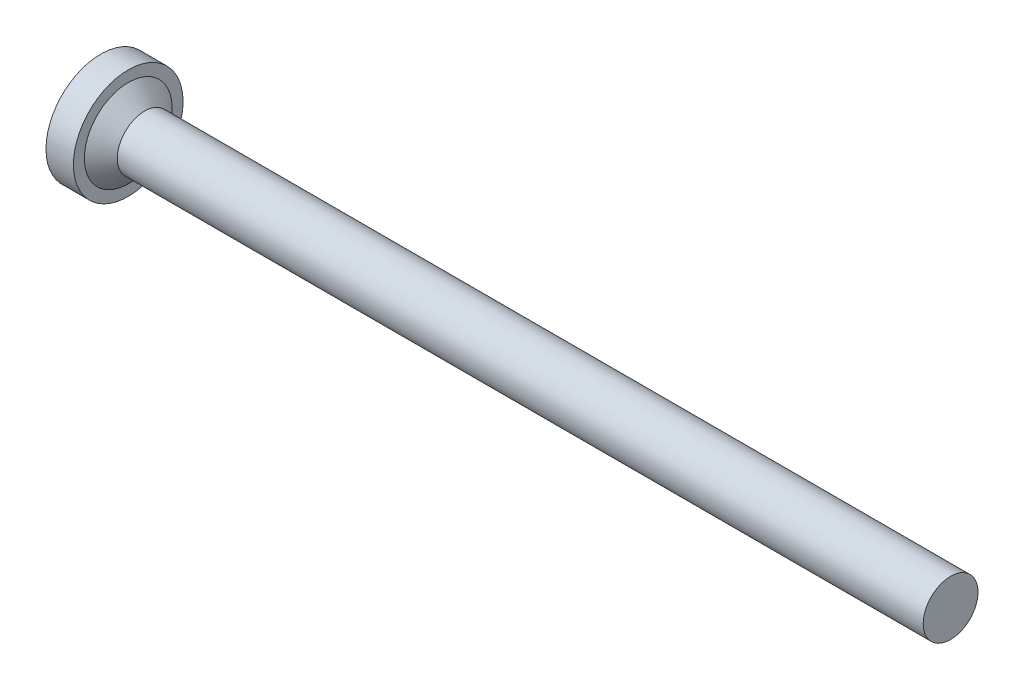
ISO-10303-21;
HEADER;
FILE_DESCRIPTION(('STEP AP214'),'2;1');
FILE_NAME('part.step','',(''),(''),'','','');
FILE_SCHEMA(('AUTOMOTIVE_DESIGN { 1 0 10303 214 1 1 1 1 }'));
ENDSEC;
DATA;
#1=APPLICATION_CONTEXT('core data for automotive mechanical design processes');
#2=APPLICATION_PROTOCOL_DEFINITION('international standard','automotive_design',2000,#1);
#3=PRODUCT_CONTEXT('',#1,'mechanical');
#4=PRODUCT('Part','Part','',(#3));
#5=PRODUCT_RELATED_PRODUCT_CATEGORY('part','',(#4));
#6=PRODUCT_DEFINITION_FORMATION('','',#4);
#7=PRODUCT_DEFINITION_CONTEXT('part definition',#1,'design');
#8=PRODUCT_DEFINITION('design','',#6,#7);
#9=PRODUCT_DEFINITION_SHAPE('','',#8);
#10=(LENGTH_UNIT() NAMED_UNIT(*) SI_UNIT(.MILLI.,.METRE.));
#11=(NAMED_UNIT(*) PLANE_ANGLE_UNIT() SI_UNIT($,.RADIAN.));
#12=(NAMED_UNIT(*) SI_UNIT($,.STERADIAN.) SOLID_ANGLE_UNIT());
#13=UNCERTAINTY_MEASURE_WITH_UNIT(LENGTH_MEASURE(1.E-05),#10,'distance_accuracy_value','');
#14=(GEOMETRIC_REPRESENTATION_CONTEXT(3) GLOBAL_UNCERTAINTY_ASSIGNED_CONTEXT((#13)) GLOBAL_UNIT_ASSIGNED_CONTEXT((#10,
#11,#12)) REPRESENTATION_CONTEXT('',''));
#15=CARTESIAN_POINT('',(0.,0.,0.));
#16=DIRECTION('',(0.,0.,1.));
#17=DIRECTION('',(1.,0.,0.));
#18=AXIS2_PLACEMENT_3D('',#15,#16,#17);
#19=CARTESIAN_POINT('',(150.,0.,0.));
#20=DIRECTION('',(-1.,0.,0.));
#21=DIRECTION('',(0.,0.,1.));
#22=AXIS2_PLACEMENT_3D('',#19,#20,#21);
#23=CYLINDRICAL_SURFACE('',#22,5.);
#24=CARTESIAN_POINT('',(3.,0.,0.));
#25=DIRECTION('',(-1.,0.,0.));
#26=DIRECTION('',(0.,0.,1.));
#27=AXIS2_PLACEMENT_3D('',#24,#25,#26);
#28=CIRCLE('',#27,5.);
#29=CARTESIAN_POINT('',(3.,0.,5.));
#30=VERTEX_POINT('',#29);
#31=EDGE_CURVE('E41',#30,#30,#28,.F.);
#32=ORIENTED_EDGE('',*,*,#31,.T.);
#33=EDGE_LOOP('',(#32));
#34=FACE_BOUND('',#33,.T.);
#35=CARTESIAN_POINT('',(150.,0.,0.));
#36=DIRECTION('',(1.,0.,0.));
#37=DIRECTION('',(0.,0.,-1.));
#38=AXIS2_PLACEMENT_3D('',#35,#36,#37);
#39=CIRCLE('',#38,5.);
#40=CARTESIAN_POINT('',(150.,0.,-5.));
#41=VERTEX_POINT('',#40);
#42=EDGE_CURVE('E45',#41,#41,#39,.T.);
#43=ORIENTED_EDGE('',*,*,#42,.F.);
#44=EDGE_LOOP('',(#43));
#45=FACE_BOUND('',#44,.T.);
#46=ADVANCED_FACE('F33',(#34,#45),#23,.T.);
#47=CARTESIAN_POINT('',(150.,0.,0.));
#48=DIRECTION('',(1.,0.,0.));
#49=DIRECTION('',(0.,0.,-1.));
#50=AXIS2_PLACEMENT_3D('',#47,#48,#49);
#51=PLANE('',#50);
#52=ORIENTED_EDGE('',*,*,#42,.T.);
#53=EDGE_LOOP('',(#52));
#54=FACE_BOUND('',#53,.T.);
#55=ADVANCED_FACE('F63',(#54),#51,.T.);
#56=CARTESIAN_POINT('',(-5.,0.,0.));
#57=DIRECTION('',(1.,0.,0.));
#58=DIRECTION('',(0.,0.,-1.));
#59=AXIS2_PLACEMENT_3D('',#56,#57,#58);
#60=CYLINDRICAL_SURFACE('',#59,10.);
#61=CARTESIAN_POINT('',(-5.,0.,0.));
#62=DIRECTION('',(-1.,0.,0.));
#63=DIRECTION('',(0.,0.,1.));
#64=AXIS2_PLACEMENT_3D('',#61,#62,#63);
#65=CIRCLE('',#64,10.);
#66=CARTESIAN_POINT('',(-5.,0.,10.));
#67=VERTEX_POINT('',#66);
#68=EDGE_CURVE('E49',#67,#67,#65,.T.);
#69=ORIENTED_EDGE('',*,*,#68,.F.);
#70=EDGE_LOOP('',(#69));
#71=FACE_BOUND('',#70,.T.);
#72=CARTESIAN_POINT('',(0.,0.,0.));
#73=DIRECTION('',(-1.,0.,0.));
#74=DIRECTION('',(0.,0.,1.));
#75=AXIS2_PLACEMENT_3D('',#72,#73,#74);
#76=CIRCLE('',#75,10.);
#77=CARTESIAN_POINT('',(0.,0.,10.));
#78=VERTEX_POINT('',#77);
#79=EDGE_CURVE('E52',#78,#78,#76,.T.);
#80=ORIENTED_EDGE('',*,*,#79,.T.);
#81=EDGE_LOOP('',(#80));
#82=FACE_BOUND('',#81,.T.);
#83=ADVANCED_FACE('F60',(#71,#82),#60,.T.);
#84=CARTESIAN_POINT('',(-5.,0.,0.));
#85=DIRECTION('',(-1.,0.,0.));
#86=DIRECTION('',(0.,0.,1.));
#87=AXIS2_PLACEMENT_3D('',#84,#85,#86);
#88=PLANE('',#87);
#89=ORIENTED_EDGE('',*,*,#68,.T.);
#90=EDGE_LOOP('',(#89));
#91=FACE_BOUND('',#90,.T.);
#92=ADVANCED_FACE('F58',(#91),#88,.T.);
#93=CARTESIAN_POINT('',(0.,0.,0.));
#94=DIRECTION('',(-1.,0.,0.));
#95=DIRECTION('',(0.,0.,1.));
#96=AXIS2_PLACEMENT_3D('',#93,#94,#95);
#97=PLANE('',#96);
#98=CARTESIAN_POINT('',(0.,0.,0.));
#99=DIRECTION('',(-1.,0.,0.));
#100=DIRECTION('',(0.,0.,1.));
#101=AXIS2_PLACEMENT_3D('',#98,#99,#100);
#102=CIRCLE('',#101,7.99999999999998);
#103=CARTESIAN_POINT('',(0.,0.,7.99999999999998));
#104=VERTEX_POINT('',#103);
#105=EDGE_CURVE('E10',#104,#104,#102,.T.);
#106=ORIENTED_EDGE('',*,*,#105,.T.);
#107=EDGE_LOOP('',(#106));
#108=FACE_BOUND('',#107,.T.);
#109=ORIENTED_EDGE('',*,*,#79,.F.);
#110=EDGE_LOOP('',(#109));
#111=FACE_BOUND('',#110,.T.);
#112=ADVANCED_FACE('F67',(#108,#111),#97,.F.);
#113=CARTESIAN_POINT('',(3.,0.,0.));
#114=DIRECTION('',(-1.,0.,0.));
#115=DIRECTION('',(0.,0.,1.));
#116=AXIS2_PLACEMENT_3D('',#113,#114,#115);
#117=CONICAL_SURFACE('',#116,5.,0.785398163397444);
#118=ORIENTED_EDGE('',*,*,#105,.F.);
#119=EDGE_LOOP('',(#118));
#120=FACE_BOUND('',#119,.T.);
#121=ORIENTED_EDGE('',*,*,#31,.F.);
#122=EDGE_LOOP('',(#121));
#123=FACE_BOUND('',#122,.T.);
#124=ADVANCED_FACE('F36',(#120,#123),#117,.T.);
#125=CLOSED_SHELL('',(#46,#55,#83,#92,#112,#124));
#126=MANIFOLD_SOLID_BREP('B2',#125);
#127=ADVANCED_BREP_SHAPE_REPRESENTATION('',(#18,#126),#14);
#128=SHAPE_DEFINITION_REPRESENTATION(#9,#127);
ENDSEC;
END-ISO-10303-21;
